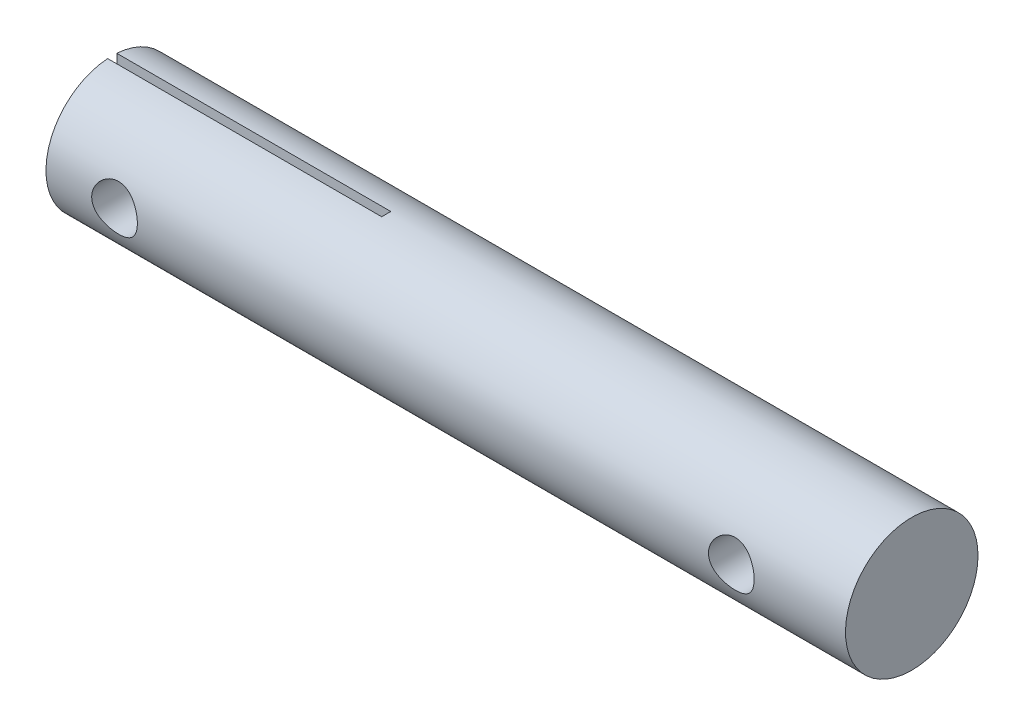
ISO-10303-21;
HEADER;
FILE_DESCRIPTION(('STEP AP214'),'2;1');
FILE_NAME('part.step','',(''),(''),'','','');
FILE_SCHEMA(('AUTOMOTIVE_DESIGN { 1 0 10303 214 1 1 1 1 }'));
ENDSEC;
DATA;
#1=APPLICATION_CONTEXT('core data for automotive mechanical design processes');
#2=APPLICATION_PROTOCOL_DEFINITION('international standard','automotive_design',2000,#1);
#3=PRODUCT_CONTEXT('',#1,'mechanical');
#4=PRODUCT('Part','Part','',(#3));
#5=PRODUCT_RELATED_PRODUCT_CATEGORY('part','',(#4));
#6=PRODUCT_DEFINITION_FORMATION('','',#4);
#7=PRODUCT_DEFINITION_CONTEXT('part definition',#1,'design');
#8=PRODUCT_DEFINITION('design','',#6,#7);
#9=PRODUCT_DEFINITION_SHAPE('','',#8);
#10=(LENGTH_UNIT() NAMED_UNIT(*) SI_UNIT(.MILLI.,.METRE.));
#11=(NAMED_UNIT(*) PLANE_ANGLE_UNIT() SI_UNIT($,.RADIAN.));
#12=(NAMED_UNIT(*) SI_UNIT($,.STERADIAN.) SOLID_ANGLE_UNIT());
#13=UNCERTAINTY_MEASURE_WITH_UNIT(LENGTH_MEASURE(1.E-05),#10,'distance_accuracy_value','');
#14=(GEOMETRIC_REPRESENTATION_CONTEXT(3) GLOBAL_UNCERTAINTY_ASSIGNED_CONTEXT((#13)) GLOBAL_UNIT_ASSIGNED_CONTEXT((#10,
#11,#12)) REPRESENTATION_CONTEXT('',''));
#15=CARTESIAN_POINT('',(0.,0.,0.));
#16=DIRECTION('',(0.,0.,1.));
#17=DIRECTION('',(1.,0.,0.));
#18=AXIS2_PLACEMENT_3D('',#15,#16,#17);
#19=CARTESIAN_POINT('',(35.,0.,0.));
#20=DIRECTION('',(-1.,0.,0.));
#21=DIRECTION('',(0.,0.,1.));
#22=AXIS2_PLACEMENT_3D('',#19,#20,#21);
#23=CYLINDRICAL_SURFACE('',#22,2.9);
#24=CARTESIAN_POINT('',(0.,0.,0.));
#25=DIRECTION('',(1.,0.,0.));
#26=DIRECTION('',(0.,0.,-1.));
#27=AXIS2_PLACEMENT_3D('',#24,#25,#26);
#28=CIRCLE('',#27,2.9);
#29=CARTESIAN_POINT('',(0.,2.89309522829789,0.2));
#30=VERTEX_POINT('',#29);
#31=CARTESIAN_POINT('',(0.,2.89309522829789,-0.2));
#32=VERTEX_POINT('',#31);
#33=EDGE_CURVE('E111',#30,#32,#28,.T.);
#34=ORIENTED_EDGE('',*,*,#33,.T.);
#35=DIRECTION('',(-1.,0.,0.));
#36=VECTOR('',#35,1.);
#37=CARTESIAN_POINT('',(35.,2.89309522829789,-0.2));
#38=LINE('',#37,#36);
#39=CARTESIAN_POINT('',(12.,2.89309522829789,-0.2));
#40=VERTEX_POINT('',#39);
#41=EDGE_CURVE('E109',#32,#40,#38,.F.);
#42=ORIENTED_EDGE('',*,*,#41,.T.);
#43=CARTESIAN_POINT('',(12.,0.,0.));
#44=DIRECTION('',(-1.,0.,0.));
#45=DIRECTION('',(0.,0.,1.));
#46=AXIS2_PLACEMENT_3D('',#43,#44,#45);
#47=CIRCLE('',#46,2.9);
#48=CARTESIAN_POINT('',(12.,2.89309522829789,0.2));
#49=VERTEX_POINT('',#48);
#50=EDGE_CURVE('E11',#49,#40,#47,.T.);
#51=ORIENTED_EDGE('',*,*,#50,.F.);
#52=DIRECTION('',(-1.,0.,0.));
#53=VECTOR('',#52,1.);
#54=CARTESIAN_POINT('',(35.,2.89309522829789,0.2));
#55=LINE('',#54,#53);
#56=EDGE_CURVE('E105',#49,#30,#55,.T.);
#57=ORIENTED_EDGE('',*,*,#56,.T.);
#58=EDGE_LOOP('',(#34,#42,#51,#57));
#59=FACE_BOUND('',#58,.T.);
#60=CARTESIAN_POINT('',(35.,0.,0.));
#61=DIRECTION('',(1.,0.,0.));
#62=DIRECTION('',(0.,0.,-1.));
#63=AXIS2_PLACEMENT_3D('',#60,#61,#62);
#64=CIRCLE('',#63,2.9);
#65=CARTESIAN_POINT('',(35.,0.,-2.9));
#66=VERTEX_POINT('',#65);
#67=EDGE_CURVE('E112',#66,#66,#64,.T.);
#68=ORIENTED_EDGE('',*,*,#67,.F.);
#69=EDGE_LOOP('',(#68));
#70=FACE_BOUND('',#69,.T.);
#71=CARTESIAN_POINT('',(30.,-1.00345238585106,-2.72086076625207));
#72=CARTESIAN_POINT('',(29.945668932359,-1.00345305999284,-2.72086021317153));
#73=CARTESIAN_POINT('',(29.8913425304579,-0.99900963956225,-2.72251153528407));
#74=CARTESIAN_POINT('',(29.7843073470255,-0.981419137113375,-2.72890129793882));
#75=CARTESIAN_POINT('',(29.7315987427294,-0.968271105011567,-2.73364007546708));
#76=CARTESIAN_POINT('',(29.6293691768065,-0.933795402899489,-2.74560649818595));
#77=CARTESIAN_POINT('',(29.5798418181211,-0.912484788995944,-2.75282895042417));
#78=CARTESIAN_POINT('',(29.4850485391322,-0.862348136474103,-2.76894323666809));
#79=CARTESIAN_POINT('',(29.4397836653777,-0.833520258689753,-2.77783547905372));
#80=CARTESIAN_POINT('',(29.3528910509856,-0.767865567456131,-2.79671067974953));
#81=CARTESIAN_POINT('',(29.3114690637809,-0.73077463919083,-2.80672237157249));
#82=CARTESIAN_POINT('',(29.2352915572014,-0.650209936416533,-2.82647224615793));
#83=CARTESIAN_POINT('',(29.2005372108595,-0.606735041151961,-2.83621038053691));
#84=CARTESIAN_POINT('',(29.1377241490165,-0.513105991243301,-2.8546557797525));
#85=CARTESIAN_POINT('',(29.1098848849622,-0.462796598211758,-2.86332568248111));
#86=CARTESIAN_POINT('',(29.0631473899614,-0.357858093927531,-2.87832267666306));
#87=CARTESIAN_POINT('',(29.044246576938,-0.303230235491404,-2.8846504445809));
#88=CARTESIAN_POINT('',(29.0166233804261,-0.193347112050207,-2.8940531545862));
#89=CARTESIAN_POINT('',(29.0075506312218,-0.138189654742776,-2.8972396740321));
#90=CARTESIAN_POINT('',(28.9987266279835,-0.0270490486292447,-2.9004060699528));
#91=CARTESIAN_POINT('',(28.9989727854618,0.028933866572825,-2.90038683687585));
#92=CARTESIAN_POINT('',(29.0085625239348,0.137625582023932,-2.89722155986127));
#93=CARTESIAN_POINT('',(29.0175215551512,0.190372821437224,-2.89420757026013));
#94=CARTESIAN_POINT('',(29.0436454923048,0.293565337173215,-2.88556784571808));
#95=CARTESIAN_POINT('',(29.0608109506516,0.344010458280033,-2.87994193495832));
#96=CARTESIAN_POINT('',(29.1030638037487,0.441955880220835,-2.86655764298503));
#97=CARTESIAN_POINT('',(29.1282530340935,0.489408372673727,-2.85877202516899));
#98=CARTESIAN_POINT('',(29.1857528086158,0.579523136222245,-2.84187578287272));
#99=CARTESIAN_POINT('',(29.2180654169426,0.622184013426225,-2.83276477459341));
#100=CARTESIAN_POINT('',(29.2907892251231,0.70376250971434,-2.81363851749343));
#101=CARTESIAN_POINT('',(29.3315245519863,0.742386348329871,-2.80360083413691));
#102=CARTESIAN_POINT('',(29.4189710079291,0.812355016067046,-2.7841338849641));
#103=CARTESIAN_POINT('',(29.4656831967856,0.843698551512897,-2.77470472749464));
#104=CARTESIAN_POINT('',(29.5647592401226,0.898670505204049,-2.75739707918534));
#105=CARTESIAN_POINT('',(29.6172031288642,0.922164154932908,-2.74954651501986));
#106=CARTESIAN_POINT('',(29.7256409113218,0.959884764577872,-2.73660804649032));
#107=CARTESIAN_POINT('',(29.7816331940916,0.97411589700545,-2.73151889835572));
#108=CARTESIAN_POINT('',(29.8927329312364,0.992293807321216,-2.72496651191048));
#109=CARTESIAN_POINT('',(29.9477562983551,0.996696547696072,-2.72334267843518));
#110=CARTESIAN_POINT('',(30.0577679839025,0.996391051294898,-2.72345471292078));
#111=CARTESIAN_POINT('',(30.1127563071081,0.991684614395714,-2.72518991717145));
#112=CARTESIAN_POINT('',(30.2189869483547,0.973706350635807,-2.73166254207127));
#113=CARTESIAN_POINT('',(30.2702924338232,0.960761879390611,-2.7362851027711));
#114=CARTESIAN_POINT('',(30.3699899499211,0.927073032755895,-2.7478811371546));
#115=CARTESIAN_POINT('',(30.4183814415743,0.906327219529438,-2.75485504418183));
#116=CARTESIAN_POINT('',(30.5126560120335,0.856844928483974,-2.77065167629178));
#117=CARTESIAN_POINT('',(30.558402842708,0.827866455685993,-2.77952800547223));
#118=CARTESIAN_POINT('',(30.6445495608127,0.7630102082043,-2.79802624699304));
#119=CARTESIAN_POINT('',(30.6849477695597,0.727130276099428,-2.80764839191506));
#120=CARTESIAN_POINT('',(30.7614090763962,0.647290220975023,-2.82715171540382));
#121=CARTESIAN_POINT('',(30.797140499569,0.603008476243457,-2.83702060425689));
#122=CARTESIAN_POINT('',(30.8606915134477,0.508832932689615,-2.85541373280247));
#123=CARTESIAN_POINT('',(30.8885113395954,0.458939300933451,-2.86393801250591));
#124=CARTESIAN_POINT('',(30.9352022099163,0.355172999359479,-2.87864166119301));
#125=CARTESIAN_POINT('',(30.9541280723282,0.301327134155515,-2.88483534639934));
#126=CARTESIAN_POINT('',(30.9825720117828,0.190960227968751,-2.89423492121065));
#127=CARTESIAN_POINT('',(30.9920937399522,0.134440234146479,-2.89744197034039));
#128=CARTESIAN_POINT('',(31.001114241551,0.0233667148665695,-2.90041149574827));
#129=CARTESIAN_POINT('',(31.0010896475362,-0.0311441224823639,-2.90033793823468));
#130=CARTESIAN_POINT('',(30.9922090935117,-0.139345884020663,-2.89715575799774));
#131=CARTESIAN_POINT('',(30.9833539197338,-0.193036880772546,-2.89404740547828));
#132=CARTESIAN_POINT('',(30.9573834204143,-0.297127069654997,-2.88520341500109));
#133=CARTESIAN_POINT('',(30.9404166532676,-0.347567637508002,-2.87951511954888));
#134=CARTESIAN_POINT('',(30.8988467648995,-0.444900676590369,-2.86609137345669));
#135=CARTESIAN_POINT('',(30.8742422244528,-0.491792486385588,-2.8583555423899));
#136=CARTESIAN_POINT('',(30.8170001214792,-0.582681258921849,-2.84125053015508));
#137=CARTESIAN_POINT('',(30.7840880832711,-0.626495484694055,-2.83182964865602));
#138=CARTESIAN_POINT('',(30.7116225365943,-0.708132805944208,-2.81252747399333));
#139=CARTESIAN_POINT('',(30.6720668261353,-0.745953906946413,-2.80264602896683));
#140=CARTESIAN_POINT('',(30.585417997114,-0.816179871818551,-2.78302676539399));
#141=CARTESIAN_POINT('',(30.5380750419355,-0.848284273074714,-2.77331312276287));
#142=CARTESIAN_POINT('',(30.4383578487793,-0.904065659755597,-2.75563521416128));
#143=CARTESIAN_POINT('',(30.3859844955296,-0.927744123669303,-2.74767064137764));
#144=CARTESIAN_POINT('',(30.2788460164568,-0.965427356382384,-2.7346556717468));
#145=CARTESIAN_POINT('',(30.2241606689957,-0.979636796504086,-2.72954403479918));
#146=CARTESIAN_POINT('',(30.1129813570893,-0.99864699927591,-2.72264756313134));
#147=CARTESIAN_POINT('',(30.056488156755,-1.00345168494405,-2.72086134129139));
#148=CARTESIAN_POINT('',(30.,-1.00345238585106,-2.72086076625207));
#149=B_SPLINE_CURVE_WITH_KNOTS('',3,(#71,#72,#73,#74,#75,#76,#77,#78,#79,#80,#81,#82,#83,#84,
#85,#86,#87,#88,#89,#90,#91,#92,#93,#94,#95,#96,#97,#98,#99,#100,#101,#102,#103,#104,#105,#106,
#107,#108,#109,#110,#111,#112,#113,#114,#115,#116,#117,#118,#119,#120,#121,#122,#123,#124,#125,
#126,#127,#128,#129,#130,#131,#132,#133,#134,#135,#136,#137,#138,#139,#140,#141,#142,#143,#144,
#145,#146,#147,#148),.UNSPECIFIED.,.T.,.F.,(4,2,2,2,2,2,2,2,2,2,2,2,2,2,2,2,2,2,2,2,2,2,2,2,2,2,
2,2,2,2,2,2,2,2,2,2,2,2,4),(0.,0.162783640432791,0.325585051165194,0.488048120137144,
0.650550974510757,0.819278892298357,0.988036467090623,1.1616113480098,1.3351360571631,
1.50224748559136,1.66931249626559,1.82932369651847,1.98934566932664,2.15148543774814,
2.31367225149579,2.48396770465968,2.65429339541776,2.82740873434802,3.00044603546556,
3.16527249789327,3.33006639568443,3.48868911362301,3.64734108107734,3.81125002275815,
3.9752102864854,4.14763900612139,4.32006259390509,4.49140903416607,4.66268892350997,
4.82541824017966,4.98813306951629,5.14797582779596,5.30784830531739,5.47391952994902,
5.64004590653315,5.81327030678005,5.98646429654651,6.15578152671845,6.32502811430031),.UNSPECIFIED.);
#150=CARTESIAN_POINT('',(30.,-1.00345238585106,-2.72086076625207));
#151=VERTEX_POINT('',#150);
#152=EDGE_CURVE('E121',#151,#151,#149,.T.);
#153=ORIENTED_EDGE('',*,*,#152,.F.);
#154=EDGE_LOOP('',(#153));
#155=FACE_BOUND('',#154,.T.);
#156=CARTESIAN_POINT('',(30.9999940404982,0.,2.9));
#157=CARTESIAN_POINT('',(30.9998066534307,0.054464581520682,2.90000044547209));
#158=CARTESIAN_POINT('',(30.9951540273774,0.108909158166563,2.89845171840446));
#159=CARTESIAN_POINT('',(30.9771022915649,0.216157473174874,2.89243177943249));
#160=CARTESIAN_POINT('',(30.9637028451294,0.268961148294963,2.88796045503368));
#161=CARTESIAN_POINT('',(30.9286738510098,0.371366993483789,2.87658461533888));
#162=CARTESIAN_POINT('',(30.9070586724938,0.420974577301273,2.86968434976551));
#163=CARTESIAN_POINT('',(30.8562767609551,0.515862220429733,2.85415499250082));
#164=CARTESIAN_POINT('',(30.8271083835114,0.56114133443872,2.84552552443424));
#165=CARTESIAN_POINT('',(30.7609226261194,0.6477502051607,2.82709145927908));
#166=CARTESIAN_POINT('',(30.7236771707835,0.688899359123851,2.81725739643333));
#167=CARTESIAN_POINT('',(30.6428854967667,0.764506273208075,2.79768802354975));
#168=CARTESIAN_POINT('',(30.5993377858124,0.798962443999026,2.78795273748656));
#169=CARTESIAN_POINT('',(30.505543985335,0.861237782008969,2.76936103341232));
#170=CARTESIAN_POINT('',(30.4551335122686,0.888821182355334,2.76054069383681));
#171=CARTESIAN_POINT('',(30.3500356479676,0.935039630398494,2.74523188932798));
#172=CARTESIAN_POINT('',(30.2953496859037,0.95367765352657,2.73874264920008));
#173=CARTESIAN_POINT('',(30.1853235578271,0.980797899806466,2.72914583302455));
#174=CARTESIAN_POINT('',(30.1300776488503,0.989621255546707,2.72592503337929));
#175=CARTESIAN_POINT('',(30.0188030109952,0.997924912373515,2.72289687865501));
#176=CARTESIAN_POINT('',(29.9627745443853,0.997408272016873,2.72308840614522));
#177=CARTESIAN_POINT('',(29.8544191705704,0.98731668940651,2.72676179672425));
#178=CARTESIAN_POINT('',(29.8020447524896,0.978183450876783,2.73008320631409));
#179=CARTESIAN_POINT('',(29.6996214351159,0.951832893957072,2.73938083645186));
#180=CARTESIAN_POINT('',(29.6495728392984,0.934614523848291,2.74535740237868));
#181=CARTESIAN_POINT('',(29.5521959949833,0.892282191854265,2.75940857278499));
#182=CARTESIAN_POINT('',(29.5049310798549,0.867034678862538,2.76751823130883));
#183=CARTESIAN_POINT('',(29.4151687197975,0.80945460858557,2.78490319254488));
#184=CARTESIAN_POINT('',(29.3726727322301,0.777119894351839,2.79417884975467));
#185=CARTESIAN_POINT('',(29.2911690999109,0.704158799925793,2.8134781728678));
#186=CARTESIAN_POINT('',(29.2524872607743,0.663171085198728,2.8235147369521));
#187=CARTESIAN_POINT('',(29.1824612227271,0.575160566726665,2.8427481160544));
#188=CARTESIAN_POINT('',(29.1511177678669,0.528137151760102,2.85194484586265));
#189=CARTESIAN_POINT('',(29.0964071278608,0.428717022858946,2.86858225182407));
#190=CARTESIAN_POINT('',(29.0731242510466,0.376270552797057,2.87600412946802));
#191=CARTESIAN_POINT('',(29.035813417151,0.267887851730581,2.88811418602225));
#192=CARTESIAN_POINT('',(29.0217819945176,0.211952936085918,2.8928033885035));
#193=CARTESIAN_POINT('',(29.003952897255,0.100961462789691,2.89875006472955));
#194=CARTESIAN_POINT('',(28.9997117901351,0.0459839946263829,2.9001562709705));
#195=CARTESIAN_POINT('',(29.0003185506263,-0.0639052332866242,2.89981604187808));
#196=CARTESIAN_POINT('',(29.0051648190918,-0.11881700289607,2.89807016123339));
#197=CARTESIAN_POINT('',(29.0234621762833,-0.225268981602774,2.89171457884867));
#198=CARTESIAN_POINT('',(29.0366460923986,-0.276860942125067,2.88719392029373));
#199=CARTESIAN_POINT('',(29.0709085491309,-0.377075950510624,2.87582321844246));
#200=CARTESIAN_POINT('',(29.0919881389462,-0.425698602805168,2.86897286558128));
#201=CARTESIAN_POINT('',(29.1421004898323,-0.520120040805735,2.85338931812693));
#202=CARTESIAN_POINT('',(29.1713404581055,-0.565800780840768,2.84460854341361));
#203=CARTESIAN_POINT('',(29.2366983655992,-0.651748288075915,2.82615633153856));
#204=CARTESIAN_POINT('',(29.2728185483872,-0.692013281929064,2.81648460437907));
#205=CARTESIAN_POINT('',(29.3529909816864,-0.768028568002402,2.79673919728646));
#206=CARTESIAN_POINT('',(29.3973438862432,-0.803463444220475,2.78666888404577));
#207=CARTESIAN_POINT('',(29.4915873227375,-0.866428441564638,2.7677402735469));
#208=CARTESIAN_POINT('',(29.5414779477942,-0.893958429738782,2.75888199667523));
#209=CARTESIAN_POINT('',(29.6454318169644,-0.940207758493911,2.7434660823836));
#210=CARTESIAN_POINT('',(29.6994877009546,-0.95894224340509,2.73690449545739));
#211=CARTESIAN_POINT('',(29.8102691618955,-0.98694722910158,2.72693244905969));
#212=CARTESIAN_POINT('',(29.8669933976262,-0.996222432433083,2.72352042390886));
#213=CARTESIAN_POINT('',(29.9781149136589,-1.0046779545737,2.72041177966843));
#214=CARTESIAN_POINT('',(30.0324667549055,-1.00438965020842,2.72051958296488));
#215=CARTESIAN_POINT('',(30.1403016547199,-0.995038917259362,2.72395333951936));
#216=CARTESIAN_POINT('',(30.1937847673116,-0.985977036420874,2.72727909187683));
#217=CARTESIAN_POINT('',(30.2972387928766,-0.959715262773381,2.73662809198885));
#218=CARTESIAN_POINT('',(30.347259989615,-0.942691032115902,2.7425929700232));
#219=CARTESIAN_POINT('',(30.4437750227589,-0.901130615751719,2.75652711698348));
#220=CARTESIAN_POINT('',(30.4902680309059,-0.876592672931816,2.76449685467639));
#221=CARTESIAN_POINT('',(30.5807694389694,-0.819360574325783,2.78201053480927));
#222=CARTESIAN_POINT('',(30.6245591665344,-0.786337970636087,2.79161076236934));
#223=CARTESIAN_POINT('',(30.706145443988,-0.713625822124462,2.81107686227833));
#224=CARTESIAN_POINT('',(30.7439402344713,-0.673934327115974,2.82094281162167));
#225=CARTESIAN_POINT('',(30.8140938419515,-0.58697807802039,2.84033823368347));
#226=CARTESIAN_POINT('',(30.846151680183,-0.539462338137375,2.84983535691801));
#227=CARTESIAN_POINT('',(30.9017928586473,-0.439394021766622,2.86696796562436));
#228=CARTESIAN_POINT('',(30.9253777064506,-0.386842343416355,2.8746037821944));
#229=CARTESIAN_POINT('',(30.9628203541613,-0.279387678342414,2.8870052949059));
#230=CARTESIAN_POINT('',(30.976884305494,-0.224563783257893,2.89183147940451));
#231=CARTESIAN_POINT('',(30.99556692245,-0.113152346944582,2.89832808821211));
#232=CARTESIAN_POINT('',(31.0001886554431,-0.0565653845270846,2.8999995373452));
#233=CARTESIAN_POINT('',(30.9999940404982,0.,2.9));
#234=B_SPLINE_CURVE_WITH_KNOTS('',3,(#156,#157,#158,#159,#160,#161,#162,#163,#164,#165,#166,
#167,#168,#169,#170,#171,#172,#173,#174,#175,#176,#177,#178,#179,#180,#181,#182,#183,#184,#185,
#186,#187,#188,#189,#190,#191,#192,#193,#194,#195,#196,#197,#198,#199,#200,#201,#202,#203,#204,
#205,#206,#207,#208,#209,#210,#211,#212,#213,#214,#215,#216,#217,#218,#219,#220,#221,#222,#223,
#224,#225,#226,#227,#228,#229,#230,#231,#232,#233),.UNSPECIFIED.,.T.,.F.,(4,2,2,2,2,2,2,2,2,2,2,
2,2,2,2,2,2,2,2,2,2,2,2,2,2,2,2,2,2,2,2,2,2,2,2,2,2,2,4),(0.,0.163186329623233,
0.326378940865444,0.489287434816881,0.652231425742869,0.820575212375444,0.988958925545896,
1.16250309549466,1.33598950072153,1.50323671978019,1.67042917159445,1.82949148194306,
1.98857448894733,2.15045566021257,2.31238616765092,2.48332953743942,2.6542902319502,
2.82698856165705,2.99962216255689,3.16426883704889,3.32888654065695,3.48847938434288,
3.64809344267939,3.812201329649,3.97636282241749,4.14852002962219,4.32068013216137,
4.49254270776626,4.66431980264654,4.82656931927434,4.9888087071164,5.14762644984914,
5.30648136118026,5.47278373043322,5.63913481646782,5.81258816901449,5.98601064428798,
6.15554646618414,6.32502720443596),.UNSPECIFIED.);
#235=CARTESIAN_POINT('',(30.9999940404982,0.,2.9));
#236=VERTEX_POINT('',#235);
#237=EDGE_CURVE('E41',#236,#236,#234,.T.);
#238=ORIENTED_EDGE('',*,*,#237,.F.);
#239=EDGE_LOOP('',(#238));
#240=FACE_BOUND('',#239,.T.);
#241=CARTESIAN_POINT('',(3.,-1.00345238585106,-2.72086076625207));
#242=CARTESIAN_POINT('',(2.94566893235899,-1.00345305999284,-2.72086021317153));
#243=CARTESIAN_POINT('',(2.89134253045788,-0.999009639562248,-2.72251153528407));
#244=CARTESIAN_POINT('',(2.7843073470255,-0.981419137113374,-2.72890129793882));
#245=CARTESIAN_POINT('',(2.7315987427294,-0.968271105011566,-2.73364007546708));
#246=CARTESIAN_POINT('',(2.62936917680646,-0.933795402899488,-2.74560649818595));
#247=CARTESIAN_POINT('',(2.57984181812114,-0.912484788995944,-2.75282895042417));
#248=CARTESIAN_POINT('',(2.48504853913221,-0.862348136474104,-2.76894323666809));
#249=CARTESIAN_POINT('',(2.43978366537773,-0.833520258689754,-2.77783547905372));
#250=CARTESIAN_POINT('',(2.35289105098564,-0.767865567456131,-2.79671067974953));
#251=CARTESIAN_POINT('',(2.31146906378093,-0.730774639190829,-2.80672237157249));
#252=CARTESIAN_POINT('',(2.23529155720145,-0.650209936416532,-2.82647224615793));
#253=CARTESIAN_POINT('',(2.20053721085951,-0.606735041151961,-2.83621038053691));
#254=CARTESIAN_POINT('',(2.1377241490165,-0.513105991243302,-2.8546557797525));
#255=CARTESIAN_POINT('',(2.10988488496225,-0.462796598211759,-2.86332568248111));
#256=CARTESIAN_POINT('',(2.06314738996144,-0.357858093927532,-2.87832267666306));
#257=CARTESIAN_POINT('',(2.04424657693797,-0.303230235491405,-2.8846504445809));
#258=CARTESIAN_POINT('',(2.01662338042609,-0.193347112050209,-2.8940531545862));
#259=CARTESIAN_POINT('',(2.00755063122176,-0.138189654742778,-2.8972396740321));
#260=CARTESIAN_POINT('',(1.9987266279835,-0.027049048629246,-2.9004060699528));
#261=CARTESIAN_POINT('',(1.99897278546178,0.0289338665728237,-2.90038683687585));
#262=CARTESIAN_POINT('',(2.00856252393479,0.137625582023931,-2.89722155986127));
#263=CARTESIAN_POINT('',(2.01752155515124,0.190372821437223,-2.89420757026013));
#264=CARTESIAN_POINT('',(2.04364549230479,0.293565337173213,-2.88556784571808));
#265=CARTESIAN_POINT('',(2.0608109506516,0.344010458280031,-2.87994193495832));
#266=CARTESIAN_POINT('',(2.10306380374873,0.441955880220833,-2.86655764298503));
#267=CARTESIAN_POINT('',(2.12825303409353,0.489408372673726,-2.85877202516899));
#268=CARTESIAN_POINT('',(2.18575280861581,0.579523136222244,-2.84187578287272));
#269=CARTESIAN_POINT('',(2.21806541694259,0.622184013426224,-2.83276477459341));
#270=CARTESIAN_POINT('',(2.29078922512315,0.703762509714338,-2.81363851749344));
#271=CARTESIAN_POINT('',(2.33152455198626,0.742386348329868,-2.80360083413691));
#272=CARTESIAN_POINT('',(2.41897100792909,0.812355016067043,-2.7841338849641));
#273=CARTESIAN_POINT('',(2.46568319678563,0.843698551512895,-2.77470472749465));
#274=CARTESIAN_POINT('',(2.56475924012264,0.898670505204048,-2.75739707918534));
#275=CARTESIAN_POINT('',(2.61720312886419,0.922164154932908,-2.74954651501986));
#276=CARTESIAN_POINT('',(2.7256409113218,0.959884764577871,-2.73660804649032));
#277=CARTESIAN_POINT('',(2.7816331940916,0.974115897005448,-2.73151889835572));
#278=CARTESIAN_POINT('',(2.89273293123637,0.992293807321214,-2.72496651191048));
#279=CARTESIAN_POINT('',(2.94775629835506,0.996696547696071,-2.72334267843518));
#280=CARTESIAN_POINT('',(3.05776798390255,0.996391051294897,-2.72345471292078));
#281=CARTESIAN_POINT('',(3.11275630710812,0.991684614395713,-2.72518991717145));
#282=CARTESIAN_POINT('',(3.21898694835471,0.973706350635806,-2.73166254207127));
#283=CARTESIAN_POINT('',(3.27029243382318,0.96076187939061,-2.7362851027711));
#284=CARTESIAN_POINT('',(3.36998994992106,0.927073032755894,-2.7478811371546));
#285=CARTESIAN_POINT('',(3.41838144157433,0.906327219529437,-2.75485504418184));
#286=CARTESIAN_POINT('',(3.51265601203353,0.856844928483975,-2.77065167629178));
#287=CARTESIAN_POINT('',(3.55840284270796,0.827866455685994,-2.77952800547223));
#288=CARTESIAN_POINT('',(3.64454956081268,0.763010208204302,-2.79802624699304));
#289=CARTESIAN_POINT('',(3.68494776955967,0.72713027609943,-2.80764839191506));
#290=CARTESIAN_POINT('',(3.76140907639617,0.647290220975024,-2.82715171540382));
#291=CARTESIAN_POINT('',(3.79714049956896,0.603008476243458,-2.83702060425689));
#292=CARTESIAN_POINT('',(3.86069151344774,0.508832932689615,-2.85541373280247));
#293=CARTESIAN_POINT('',(3.88851133959538,0.458939300933451,-2.86393801250591));
#294=CARTESIAN_POINT('',(3.93520220991634,0.355172999359479,-2.87864166119301));
#295=CARTESIAN_POINT('',(3.95412807232818,0.301327134155515,-2.88483534639934));
#296=CARTESIAN_POINT('',(3.98257201178281,0.190960227968752,-2.89423492121065));
#297=CARTESIAN_POINT('',(3.99209373995218,0.134440234146481,-2.89744197034039));
#298=CARTESIAN_POINT('',(4.00111424155103,0.0233667148665714,-2.90041149574827));
#299=CARTESIAN_POINT('',(4.0010896475362,-0.0311441224823622,-2.90033793823468));
#300=CARTESIAN_POINT('',(3.99220909351165,-0.139345884020662,-2.89715575799774));
#301=CARTESIAN_POINT('',(3.98335391973378,-0.193036880772544,-2.89404740547828));
#302=CARTESIAN_POINT('',(3.95738342041427,-0.297127069654995,-2.88520341500109));
#303=CARTESIAN_POINT('',(3.94041665326756,-0.347567637508001,-2.87951511954888));
#304=CARTESIAN_POINT('',(3.8988467648995,-0.444900676590368,-2.86609137345669));
#305=CARTESIAN_POINT('',(3.87424222445277,-0.491792486385586,-2.8583555423899));
#306=CARTESIAN_POINT('',(3.81700012147922,-0.582681258921847,-2.84125053015508));
#307=CARTESIAN_POINT('',(3.78408808327106,-0.626495484694052,-2.83182964865602));
#308=CARTESIAN_POINT('',(3.71162253659431,-0.708132805944205,-2.81252747399333));
#309=CARTESIAN_POINT('',(3.67206682613533,-0.745953906946411,-2.80264602896683));
#310=CARTESIAN_POINT('',(3.585417997114,-0.816179871818548,-2.78302676539399));
#311=CARTESIAN_POINT('',(3.53807504193548,-0.848284273074711,-2.77331312276287));
#312=CARTESIAN_POINT('',(3.43835784877927,-0.904065659755595,-2.75563521416128));
#313=CARTESIAN_POINT('',(3.38598449552958,-0.927744123669301,-2.74767064137764));
#314=CARTESIAN_POINT('',(3.27884601645684,-0.965427356382383,-2.7346556717468));
#315=CARTESIAN_POINT('',(3.22416066899574,-0.979636796504084,-2.72954403479919));
#316=CARTESIAN_POINT('',(3.11298135708933,-0.998646999275909,-2.72264756313134));
#317=CARTESIAN_POINT('',(3.05648815675502,-1.00345168494404,-2.72086134129139));
#318=CARTESIAN_POINT('',(3.,-1.00345238585106,-2.72086076625207));
#319=B_SPLINE_CURVE_WITH_KNOTS('',3,(#241,#242,#243,#244,#245,#246,#247,#248,#249,#250,#251,
#252,#253,#254,#255,#256,#257,#258,#259,#260,#261,#262,#263,#264,#265,#266,#267,#268,#269,#270,
#271,#272,#273,#274,#275,#276,#277,#278,#279,#280,#281,#282,#283,#284,#285,#286,#287,#288,#289,
#290,#291,#292,#293,#294,#295,#296,#297,#298,#299,#300,#301,#302,#303,#304,#305,#306,#307,#308,
#309,#310,#311,#312,#313,#314,#315,#316,#317,#318),.UNSPECIFIED.,.T.,.F.,(4,2,2,2,2,2,2,2,2,2,2,
2,2,2,2,2,2,2,2,2,2,2,2,2,2,2,2,2,2,2,2,2,2,2,2,2,2,2,4),(0.,0.162783640432791,
0.325585051165192,0.48804812013714,0.650550974510754,0.819278892298359,0.98803646709062,
1.1616113480098,1.33513605716309,1.50224748559135,1.66931249626558,1.82932369651846,
1.98934566932663,2.15148543774814,2.31367225149579,2.48396770465968,2.65429339541776,
2.82740873434802,3.00044603546556,3.16527249789327,3.33006639568443,3.48868911362301,
3.64734108107733,3.81125002275815,3.97521028648539,4.14763900612138,4.32006259390509,
4.49140903416606,4.66268892350996,4.82541824017965,4.98813306951628,5.14797582779595,
5.30784830531738,5.47391952994901,5.64004590653313,5.81327030678004,5.9864642965465,
6.15578152671844,6.3250281143003),.UNSPECIFIED.);
#320=CARTESIAN_POINT('',(3.,-1.00345238585106,-2.72086076625207));
#321=VERTEX_POINT('',#320);
#322=EDGE_CURVE('E172',#321,#321,#319,.T.);
#323=ORIENTED_EDGE('',*,*,#322,.F.);
#324=EDGE_LOOP('',(#323));
#325=FACE_BOUND('',#324,.T.);
#326=CARTESIAN_POINT('',(3.99999404049821,0.,2.9));
#327=CARTESIAN_POINT('',(3.99980665343065,0.054464581520682,2.90000044547209));
#328=CARTESIAN_POINT('',(3.99515402737745,0.108909158166563,2.89845171840446));
#329=CARTESIAN_POINT('',(3.97710229156492,0.216157473174874,2.89243177943249));
#330=CARTESIAN_POINT('',(3.9637028451294,0.268961148294962,2.88796045503368));
#331=CARTESIAN_POINT('',(3.92867385100979,0.371366993483788,2.87658461533888));
#332=CARTESIAN_POINT('',(3.90705867249376,0.420974577301274,2.86968434976551));
#333=CARTESIAN_POINT('',(3.8562767609551,0.515862220429733,2.85415499250082));
#334=CARTESIAN_POINT('',(3.82710838351144,0.56114133443872,2.84552552443424));
#335=CARTESIAN_POINT('',(3.76092262611943,0.647750205160698,2.82709145927908));
#336=CARTESIAN_POINT('',(3.72367717078349,0.688899359123849,2.81725739643333));
#337=CARTESIAN_POINT('',(3.6428854967667,0.764506273208073,2.79768802354975));
#338=CARTESIAN_POINT('',(3.59933778581236,0.798962443999024,2.78795273748656));
#339=CARTESIAN_POINT('',(3.50554398533497,0.861237782008968,2.76936103341232));
#340=CARTESIAN_POINT('',(3.45513351226858,0.888821182355332,2.76054069383681));
#341=CARTESIAN_POINT('',(3.3500356479676,0.935039630398493,2.74523188932798));
#342=CARTESIAN_POINT('',(3.2953496859037,0.953677653526569,2.73874264920008));
#343=CARTESIAN_POINT('',(3.18532355782714,0.980797899806465,2.72914583302455));
#344=CARTESIAN_POINT('',(3.13007764885033,0.989621255546706,2.72592503337929));
#345=CARTESIAN_POINT('',(3.01880301099517,0.997924912373514,2.72289687865501));
#346=CARTESIAN_POINT('',(2.96277454438534,0.997408272016872,2.72308840614522));
#347=CARTESIAN_POINT('',(2.85441917057035,0.987316689406509,2.72676179672425));
#348=CARTESIAN_POINT('',(2.80204475248956,0.978183450876782,2.73008320631409));
#349=CARTESIAN_POINT('',(2.69962143511588,0.951832893957071,2.73938083645186));
#350=CARTESIAN_POINT('',(2.64957283929843,0.93461452384829,2.74535740237868));
#351=CARTESIAN_POINT('',(2.55219599498333,0.892282191854265,2.75940857278499));
#352=CARTESIAN_POINT('',(2.50493107985492,0.867034678862537,2.76751823130884));
#353=CARTESIAN_POINT('',(2.41516871979746,0.80945460858557,2.78490319254488));
#354=CARTESIAN_POINT('',(2.37267273223009,0.777119894351839,2.79417884975467));
#355=CARTESIAN_POINT('',(2.29116909991086,0.704158799925793,2.8134781728678));
#356=CARTESIAN_POINT('',(2.25248726077434,0.663171085198727,2.8235147369521));
#357=CARTESIAN_POINT('',(2.18246122272713,0.575160566726664,2.8427481160544));
#358=CARTESIAN_POINT('',(2.15111776786691,0.528137151760101,2.85194484586265));
#359=CARTESIAN_POINT('',(2.09640712786078,0.428717022858946,2.86858225182407));
#360=CARTESIAN_POINT('',(2.07312425104658,0.376270552797056,2.87600412946802));
#361=CARTESIAN_POINT('',(2.03581341715102,0.267887851730581,2.88811418602225));
#362=CARTESIAN_POINT('',(2.02178199451763,0.211952936085917,2.8928033885035));
#363=CARTESIAN_POINT('',(2.00395289725498,0.100961462789691,2.89875006472955));
#364=CARTESIAN_POINT('',(1.99971179013511,0.0459839946263828,2.9001562709705));
#365=CARTESIAN_POINT('',(2.00031855062634,-0.0639052332866241,2.89981604187808));
#366=CARTESIAN_POINT('',(2.0051648190918,-0.11881700289607,2.89807016123339));
#367=CARTESIAN_POINT('',(2.02346217628331,-0.225268981602774,2.89171457884867));
#368=CARTESIAN_POINT('',(2.03664609239861,-0.276860942125065,2.88719392029373));
#369=CARTESIAN_POINT('',(2.07090854913095,-0.377075950510623,2.87582321844246));
#370=CARTESIAN_POINT('',(2.09198813894617,-0.425698602805168,2.86897286558128));
#371=CARTESIAN_POINT('',(2.14210048983227,-0.520120040805734,2.85338931812693));
#372=CARTESIAN_POINT('',(2.1713404581055,-0.565800780840766,2.84460854341361));
#373=CARTESIAN_POINT('',(2.23669836559923,-0.651748288075913,2.82615633153855));
#374=CARTESIAN_POINT('',(2.27281854838725,-0.692013281929063,2.81648460437907));
#375=CARTESIAN_POINT('',(2.35299098168643,-0.768028568002401,2.79673919728646));
#376=CARTESIAN_POINT('',(2.39734388624321,-0.803463444220474,2.78666888404577));
#377=CARTESIAN_POINT('',(2.49158732273754,-0.866428441564636,2.7677402735469));
#378=CARTESIAN_POINT('',(2.54147794779419,-0.893958429738781,2.75888199667523));
#379=CARTESIAN_POINT('',(2.64543181696445,-0.940207758493911,2.7434660823836));
#380=CARTESIAN_POINT('',(2.69948770095462,-0.958942243405089,2.73690449545739));
#381=CARTESIAN_POINT('',(2.81026916189554,-0.986947229101579,2.72693244905969));
#382=CARTESIAN_POINT('',(2.86699339762616,-0.996222432433082,2.72352042390887));
#383=CARTESIAN_POINT('',(2.97811491365893,-1.0046779545737,2.72041177966843));
#384=CARTESIAN_POINT('',(3.03246675490548,-1.00438965020841,2.72051958296488));
#385=CARTESIAN_POINT('',(3.14030165471986,-0.995038917259361,2.72395333951936));
#386=CARTESIAN_POINT('',(3.19378476731157,-0.985977036420873,2.72727909187684));
#387=CARTESIAN_POINT('',(3.29723879287659,-0.95971526277338,2.73662809198885));
#388=CARTESIAN_POINT('',(3.34725998961496,-0.942691032115901,2.7425929700232));
#389=CARTESIAN_POINT('',(3.44377502275892,-0.901130615751718,2.75652711698348));
#390=CARTESIAN_POINT('',(3.49026803090592,-0.876592672931814,2.7644968546764));
#391=CARTESIAN_POINT('',(3.5807694389694,-0.81936057432578,2.78201053480927));
#392=CARTESIAN_POINT('',(3.62455916653442,-0.786337970636084,2.79161076236934));
#393=CARTESIAN_POINT('',(3.70614544398798,-0.713625822124459,2.81107686227833));
#394=CARTESIAN_POINT('',(3.74394023447129,-0.673934327115972,2.82094281162167));
#395=CARTESIAN_POINT('',(3.81409384195148,-0.58697807802039,2.84033823368347));
#396=CARTESIAN_POINT('',(3.84615168018305,-0.539462338137375,2.84983535691801));
#397=CARTESIAN_POINT('',(3.9017928586473,-0.439394021766622,2.86696796562436));
#398=CARTESIAN_POINT('',(3.92537770645062,-0.386842343416355,2.8746037821944));
#399=CARTESIAN_POINT('',(3.96282035416129,-0.279387678342414,2.8870052949059));
#400=CARTESIAN_POINT('',(3.97688430549397,-0.224563783257893,2.89183147940451));
#401=CARTESIAN_POINT('',(3.99556692245,-0.113152346944582,2.89832808821211));
#402=CARTESIAN_POINT('',(4.00018865544312,-0.0565653845270848,2.8999995373452));
#403=CARTESIAN_POINT('',(3.99999404049821,0.,2.9));
#404=B_SPLINE_CURVE_WITH_KNOTS('',3,(#326,#327,#328,#329,#330,#331,#332,#333,#334,#335,#336,
#337,#338,#339,#340,#341,#342,#343,#344,#345,#346,#347,#348,#349,#350,#351,#352,#353,#354,#355,
#356,#357,#358,#359,#360,#361,#362,#363,#364,#365,#366,#367,#368,#369,#370,#371,#372,#373,#374,
#375,#376,#377,#378,#379,#380,#381,#382,#383,#384,#385,#386,#387,#388,#389,#390,#391,#392,#393,
#394,#395,#396,#397,#398,#399,#400,#401,#402,#403),.UNSPECIFIED.,.T.,.F.,(4,2,2,2,2,2,2,2,2,2,2,
2,2,2,2,2,2,2,2,2,2,2,2,2,2,2,2,2,2,2,2,2,2,2,2,2,2,2,4),(0.,0.163186329623232,
0.326378940865444,0.489287434816881,0.652231425742869,0.820575212375441,0.988958925545892,
1.16250309549465,1.33598950072153,1.50323671978019,1.67042917159445,1.82949148194305,
1.98857448894733,2.15045566021257,2.31238616765092,2.48332953743942,2.65429023195019,
2.82698856165705,2.99962216255688,3.16426883704888,3.32888654065694,3.48847938434288,
3.64809344267939,3.812201329649,3.97636282241749,4.14852002962218,4.32068013216137,
4.49254270776625,4.66431980264653,4.82656931927434,4.98880870711639,5.14762644984913,
5.30648136118026,5.47278373043322,5.63913481646781,5.81258816901448,5.98601064428797,
6.15554646618413,6.32502720443595),.UNSPECIFIED.);
#405=CARTESIAN_POINT('',(3.99999404049821,0.,2.9));
#406=VERTEX_POINT('',#405);
#407=EDGE_CURVE('E126',#406,#406,#404,.T.);
#408=ORIENTED_EDGE('',*,*,#407,.F.);
#409=EDGE_LOOP('',(#408));
#410=FACE_BOUND('',#409,.T.);
#411=ADVANCED_FACE('F37',(#59,#70,#155,#240,#325,#410),#23,.T.);
#412=CARTESIAN_POINT('',(35.,0.,0.));
#413=DIRECTION('',(1.,0.,0.));
#414=DIRECTION('',(0.,0.,-1.));
#415=AXIS2_PLACEMENT_3D('',#412,#413,#414);
#416=PLANE('',#415);
#417=ORIENTED_EDGE('',*,*,#67,.T.);
#418=EDGE_LOOP('',(#417));
#419=FACE_BOUND('',#418,.T.);
#420=ADVANCED_FACE('F149',(#419),#416,.T.);
#421=CARTESIAN_POINT('',(0.,0.,0.));
#422=DIRECTION('',(1.,0.,0.));
#423=DIRECTION('',(0.,0.,-1.));
#424=AXIS2_PLACEMENT_3D('',#421,#422,#423);
#425=PLANE('',#424);
#426=DIRECTION('',(0.,0.,1.));
#427=VECTOR('',#426,1.);
#428=CARTESIAN_POINT('',(0.,-2.32901081224555,-0.199999999999999));
#429=LINE('',#428,#427);
#430=CARTESIAN_POINT('',(0.,-2.32901081224555,-0.199999999999999));
#431=VERTEX_POINT('',#430);
#432=CARTESIAN_POINT('',(0.,-2.32901081224555,0.200000000000001));
#433=VERTEX_POINT('',#432);
#434=EDGE_CURVE('E102',#431,#433,#429,.T.);
#435=ORIENTED_EDGE('',*,*,#434,.F.);
#436=DIRECTION('',(0.,1.,0.));
#437=VECTOR('',#436,1.);
#438=CARTESIAN_POINT('',(0.,0.,-0.2));
#439=LINE('',#438,#437);
#440=EDGE_CURVE('E50',#431,#32,#439,.T.);
#441=ORIENTED_EDGE('',*,*,#440,.T.);
#442=ORIENTED_EDGE('',*,*,#33,.F.);
#443=DIRECTION('',(0.,1.,0.));
#444=VECTOR('',#443,1.);
#445=CARTESIAN_POINT('',(0.,3.12152143585721,0.2));
#446=LINE('',#445,#444);
#447=EDGE_CURVE('E88',#433,#30,#446,.T.);
#448=ORIENTED_EDGE('',*,*,#447,.F.);
#449=EDGE_LOOP('',(#435,#441,#442,#448));
#450=FACE_BOUND('',#449,.T.);
#451=ADVANCED_FACE('F139',(#450),#425,.F.);
#452=CARTESIAN_POINT('',(12.,0.,0.));
#453=DIRECTION('',(-1.,0.,0.));
#454=DIRECTION('',(0.,0.,1.));
#455=AXIS2_PLACEMENT_3D('',#452,#453,#454);
#456=PLANE('',#455);
#457=ORIENTED_EDGE('',*,*,#50,.T.);
#458=DIRECTION('',(0.,-1.,0.));
#459=VECTOR('',#458,1.);
#460=CARTESIAN_POINT('',(12.,3.12152143585721,-0.2));
#461=LINE('',#460,#459);
#462=CARTESIAN_POINT('',(12.,-2.32901081224555,-0.199999999999999));
#463=VERTEX_POINT('',#462);
#464=EDGE_CURVE('E83',#40,#463,#461,.T.);
#465=ORIENTED_EDGE('',*,*,#464,.T.);
#466=DIRECTION('',(0.,0.,1.));
#467=VECTOR('',#466,1.);
#468=CARTESIAN_POINT('',(12.,-2.32901081224555,-0.199999999999999));
#469=LINE('',#468,#467);
#470=CARTESIAN_POINT('',(12.,-2.32901081224555,0.200000000000001));
#471=VERTEX_POINT('',#470);
#472=EDGE_CURVE('E85',#463,#471,#469,.T.);
#473=ORIENTED_EDGE('',*,*,#472,.T.);
#474=DIRECTION('',(0.,1.,0.));
#475=VECTOR('',#474,1.);
#476=CARTESIAN_POINT('',(12.,3.12152143585721,0.2));
#477=LINE('',#476,#475);
#478=EDGE_CURVE('E94',#471,#49,#477,.T.);
#479=ORIENTED_EDGE('',*,*,#478,.T.);
#480=EDGE_LOOP('',(#457,#465,#473,#479));
#481=FACE_BOUND('',#480,.T.);
#482=ADVANCED_FACE('F84',(#481),#456,.T.);
#483=CARTESIAN_POINT('',(12.,3.12152143585721,-0.2));
#484=DIRECTION('',(0.,0.,-1.));
#485=DIRECTION('',(0.,1.,0.));
#486=AXIS2_PLACEMENT_3D('',#483,#484,#485);
#487=PLANE('',#486);
#488=CARTESIAN_POINT('',(3.,-0.00345238585105744,-0.200000000000001));
#489=DIRECTION('',(0.,0.,-1.));
#490=DIRECTION('',(0.,1.,0.));
#491=AXIS2_PLACEMENT_3D('',#488,#489,#490);
#492=CIRCLE('',#491,1.);
#493=CARTESIAN_POINT('',(3.,0.996547614148943,-0.200000000000001));
#494=VERTEX_POINT('',#493);
#495=EDGE_CURVE('E120',#494,#494,#492,.F.);
#496=ORIENTED_EDGE('',*,*,#495,.F.);
#497=EDGE_LOOP('',(#496));
#498=FACE_BOUND('',#497,.T.);
#499=ORIENTED_EDGE('',*,*,#440,.F.);
#500=DIRECTION('',(-1.,0.,0.));
#501=VECTOR('',#500,1.);
#502=CARTESIAN_POINT('',(12.,-2.32901081224555,-0.199999999999999));
#503=LINE('',#502,#501);
#504=EDGE_CURVE('E58',#463,#431,#503,.T.);
#505=ORIENTED_EDGE('',*,*,#504,.F.);
#506=ORIENTED_EDGE('',*,*,#464,.F.);
#507=ORIENTED_EDGE('',*,*,#41,.F.);
#508=EDGE_LOOP('',(#499,#505,#506,#507));
#509=FACE_BOUND('',#508,.T.);
#510=ADVANCED_FACE('F90',(#498,#509),#487,.F.);
#511=CARTESIAN_POINT('',(12.,3.12152143585721,0.2));
#512=DIRECTION('',(0.,0.,1.));
#513=DIRECTION('',(0.,-1.,0.));
#514=AXIS2_PLACEMENT_3D('',#511,#512,#513);
#515=PLANE('',#514);
#516=CARTESIAN_POINT('',(3.,-0.00345238585105739,0.200000000000001));
#517=DIRECTION('',(0.,0.,1.));
#518=DIRECTION('',(0.,-1.,0.));
#519=AXIS2_PLACEMENT_3D('',#516,#517,#518);
#520=CIRCLE('',#519,1.);
#521=CARTESIAN_POINT('',(3.,-1.00345238585106,0.200000000000001));
#522=VERTEX_POINT('',#521);
#523=EDGE_CURVE('E118',#522,#522,#520,.F.);
#524=ORIENTED_EDGE('',*,*,#523,.F.);
#525=EDGE_LOOP('',(#524));
#526=FACE_BOUND('',#525,.T.);
#527=ORIENTED_EDGE('',*,*,#478,.F.);
#528=DIRECTION('',(-1.,0.,0.));
#529=VECTOR('',#528,1.);
#530=CARTESIAN_POINT('',(12.,-2.32901081224555,0.200000000000001));
#531=LINE('',#530,#529);
#532=EDGE_CURVE('E93',#471,#433,#531,.T.);
#533=ORIENTED_EDGE('',*,*,#532,.T.);
#534=ORIENTED_EDGE('',*,*,#447,.T.);
#535=ORIENTED_EDGE('',*,*,#56,.F.);
#536=EDGE_LOOP('',(#527,#533,#534,#535));
#537=FACE_BOUND('',#536,.T.);
#538=ADVANCED_FACE('F140',(#526,#537),#515,.F.);
#539=CARTESIAN_POINT('',(12.,-2.32901081224555,-0.199999999999999));
#540=DIRECTION('',(0.,-1.,0.));
#541=DIRECTION('',(0.,0.,-1.));
#542=AXIS2_PLACEMENT_3D('',#539,#540,#541);
#543=PLANE('',#542);
#544=ORIENTED_EDGE('',*,*,#434,.T.);
#545=ORIENTED_EDGE('',*,*,#532,.F.);
#546=ORIENTED_EDGE('',*,*,#472,.F.);
#547=ORIENTED_EDGE('',*,*,#504,.T.);
#548=EDGE_LOOP('',(#544,#545,#546,#547));
#549=FACE_BOUND('',#548,.T.);
#550=ADVANCED_FACE('F96',(#549),#543,.F.);
#551=CARTESIAN_POINT('',(3.,-0.00345238585105858,-9.8));
#552=DIRECTION('',(0.,0.,1.));
#553=DIRECTION('',(0.,-1.,0.));
#554=AXIS2_PLACEMENT_3D('',#551,#552,#553);
#555=CYLINDRICAL_SURFACE('',#554,1.);
#556=ORIENTED_EDGE('',*,*,#523,.T.);
#557=EDGE_LOOP('',(#556));
#558=FACE_BOUND('',#557,.T.);
#559=ORIENTED_EDGE('',*,*,#407,.T.);
#560=EDGE_LOOP('',(#559));
#561=FACE_BOUND('',#560,.T.);
#562=ADVANCED_FACE('F134',(#558,#561),#555,.F.);
#563=ORIENTED_EDGE('',*,*,#495,.T.);
#564=EDGE_LOOP('',(#563));
#565=FACE_BOUND('',#564,.T.);
#566=ORIENTED_EDGE('',*,*,#322,.T.);
#567=EDGE_LOOP('',(#566));
#568=FACE_BOUND('',#567,.T.);
#569=ADVANCED_FACE('F132',(#565,#568),#555,.F.);
#570=CARTESIAN_POINT('',(30.,-0.00345238585105867,-9.8));
#571=DIRECTION('',(0.,0.,1.));
#572=DIRECTION('',(0.,-1.,0.));
#573=AXIS2_PLACEMENT_3D('',#570,#571,#572);
#574=CYLINDRICAL_SURFACE('',#573,1.);
#575=ORIENTED_EDGE('',*,*,#152,.T.);
#576=EDGE_LOOP('',(#575));
#577=FACE_BOUND('',#576,.T.);
#578=ORIENTED_EDGE('',*,*,#237,.T.);
#579=EDGE_LOOP('',(#578));
#580=FACE_BOUND('',#579,.T.);
#581=ADVANCED_FACE('F127',(#577,#580),#574,.F.);
#582=CLOSED_SHELL('',(#411,#420,#451,#482,#510,#538,#550,#562,#569,#581));
#583=MANIFOLD_SOLID_BREP('B2',#582);
#584=ADVANCED_BREP_SHAPE_REPRESENTATION('',(#18,#583),#14);
#585=SHAPE_DEFINITION_REPRESENTATION(#9,#584);
ENDSEC;
END-ISO-10303-21;
